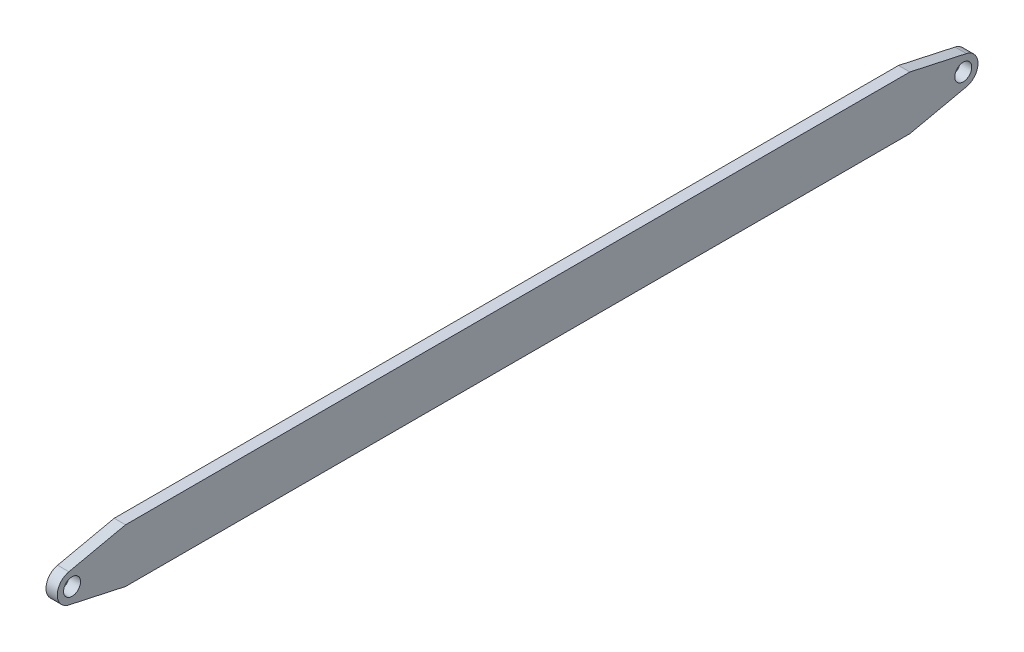
ISO-10303-21;
HEADER;
FILE_DESCRIPTION(('STEP AP214'),'2;1');
FILE_NAME('part.step','',(''),(''),'','','');
FILE_SCHEMA(('AUTOMOTIVE_DESIGN { 1 0 10303 214 1 1 1 1 }'));
ENDSEC;
DATA;
#1=APPLICATION_CONTEXT('core data for automotive mechanical design processes');
#2=APPLICATION_PROTOCOL_DEFINITION('international standard','automotive_design',2000,#1);
#3=PRODUCT_CONTEXT('',#1,'mechanical');
#4=PRODUCT('Part','Part','',(#3));
#5=PRODUCT_RELATED_PRODUCT_CATEGORY('part','',(#4));
#6=PRODUCT_DEFINITION_FORMATION('','',#4);
#7=PRODUCT_DEFINITION_CONTEXT('part definition',#1,'design');
#8=PRODUCT_DEFINITION('design','',#6,#7);
#9=PRODUCT_DEFINITION_SHAPE('','',#8);
#10=(LENGTH_UNIT() NAMED_UNIT(*) SI_UNIT(.MILLI.,.METRE.));
#11=(NAMED_UNIT(*) PLANE_ANGLE_UNIT() SI_UNIT($,.RADIAN.));
#12=(NAMED_UNIT(*) SI_UNIT($,.STERADIAN.) SOLID_ANGLE_UNIT());
#13=UNCERTAINTY_MEASURE_WITH_UNIT(LENGTH_MEASURE(1.E-05),#10,'distance_accuracy_value','');
#14=(GEOMETRIC_REPRESENTATION_CONTEXT(3) GLOBAL_UNCERTAINTY_ASSIGNED_CONTEXT((#13)) GLOBAL_UNIT_ASSIGNED_CONTEXT((#10,
#11,#12)) REPRESENTATION_CONTEXT('',''));
#15=CARTESIAN_POINT('',(0.,0.,0.));
#16=DIRECTION('',(0.,0.,1.));
#17=DIRECTION('',(1.,0.,0.));
#18=AXIS2_PLACEMENT_3D('',#15,#16,#17);
#19=CARTESIAN_POINT('',(3.175,0.,-500.));
#20=DIRECTION('',(-1.,0.,0.));
#21=DIRECTION('',(0.,0.,1.));
#22=AXIS2_PLACEMENT_3D('',#19,#20,#21);
#23=PLANE('',#22);
#24=DIRECTION('',(0.,0.213098674662795,0.977030682658923));
#25=VECTOR('',#24,1.);
#26=CARTESIAN_POINT('',(3.175,15.,-470.));
#27=LINE('',#26,#25);
#28=CARTESIAN_POINT('',(3.175,8.07271601546935,-501.760727799401));
#29=VERTEX_POINT('',#28);
#30=CARTESIAN_POINT('',(3.175,15.,-470.));
#31=VERTEX_POINT('',#30);
#32=EDGE_CURVE('E164',#29,#31,#27,.T.);
#33=ORIENTED_EDGE('',*,*,#32,.T.);
#34=DIRECTION('',(0.,0.,1.));
#35=VECTOR('',#34,1.);
#36=CARTESIAN_POINT('',(3.175,15.,-30.));
#37=LINE('',#36,#35);
#38=CARTESIAN_POINT('',(3.175,15.,-30.));
#39=VERTEX_POINT('',#38);
#40=EDGE_CURVE('E100',#31,#39,#37,.T.);
#41=ORIENTED_EDGE('',*,*,#40,.T.);
#42=DIRECTION('',(0.,-0.213098674662795,0.977030682658923));
#43=VECTOR('',#42,1.);
#44=CARTESIAN_POINT('',(3.175,15.,-30.));
#45=LINE('',#44,#43);
#46=CARTESIAN_POINT('',(3.175,8.07271601546935,1.76072779940134));
#47=VERTEX_POINT('',#46);
#48=EDGE_CURVE('E185',#39,#47,#45,.T.);
#49=ORIENTED_EDGE('',*,*,#48,.T.);
#50=CARTESIAN_POINT('',(3.175,0.,0.));
#51=DIRECTION('',(1.,0.,0.));
#52=DIRECTION('',(0.,0.,-1.));
#53=AXIS2_PLACEMENT_3D('',#50,#51,#52);
#54=CIRCLE('',#53,8.2625);
#55=CARTESIAN_POINT('',(3.175,-8.07271601546935,1.76072779940135));
#56=VERTEX_POINT('',#55);
#57=EDGE_CURVE('E199',#47,#56,#54,.T.);
#58=ORIENTED_EDGE('',*,*,#57,.T.);
#59=DIRECTION('',(0.,-0.213098674662795,-0.977030682658923));
#60=VECTOR('',#59,1.);
#61=CARTESIAN_POINT('',(3.175,-15.,-30.));
#62=LINE('',#61,#60);
#63=CARTESIAN_POINT('',(3.175,-15.,-30.));
#64=VERTEX_POINT('',#63);
#65=EDGE_CURVE('E119',#56,#64,#62,.T.);
#66=ORIENTED_EDGE('',*,*,#65,.T.);
#67=DIRECTION('',(0.,0.,-1.));
#68=VECTOR('',#67,1.);
#69=CARTESIAN_POINT('',(3.175,-15.,-30.));
#70=LINE('',#69,#68);
#71=CARTESIAN_POINT('',(3.175,-15.,-470.));
#72=VERTEX_POINT('',#71);
#73=EDGE_CURVE('E113',#64,#72,#70,.T.);
#74=ORIENTED_EDGE('',*,*,#73,.T.);
#75=DIRECTION('',(0.,0.213098674662795,-0.977030682658923));
#76=VECTOR('',#75,1.);
#77=CARTESIAN_POINT('',(3.175,-15.,-470.));
#78=LINE('',#77,#76);
#79=CARTESIAN_POINT('',(3.175,-8.07271601546935,-501.760727799401));
#80=VERTEX_POINT('',#79);
#81=EDGE_CURVE('E117',#72,#80,#78,.T.);
#82=ORIENTED_EDGE('',*,*,#81,.T.);
#83=CARTESIAN_POINT('',(3.175,0.,-500.));
#84=DIRECTION('',(1.,0.,0.));
#85=DIRECTION('',(0.,0.,1.));
#86=AXIS2_PLACEMENT_3D('',#83,#84,#85);
#87=CIRCLE('',#86,8.26249999999999);
#88=EDGE_CURVE('E57',#80,#29,#87,.T.);
#89=ORIENTED_EDGE('',*,*,#88,.T.);
#90=EDGE_LOOP('',(#33,#41,#49,#58,#66,#74,#82,#89));
#91=FACE_BOUND('',#90,.T.);
#92=CARTESIAN_POINT('',(3.175,0.,0.));
#93=DIRECTION('',(1.,0.,0.));
#94=DIRECTION('',(0.,0.,-1.));
#95=AXIS2_PLACEMENT_3D('',#92,#93,#94);
#96=CIRCLE('',#95,4.76250000000001);
#97=CARTESIAN_POINT('',(3.175,0.,-4.76250000000001));
#98=VERTEX_POINT('',#97);
#99=EDGE_CURVE('E146',#98,#98,#96,.T.);
#100=ORIENTED_EDGE('',*,*,#99,.F.);
#101=EDGE_LOOP('',(#100));
#102=FACE_BOUND('',#101,.T.);
#103=CARTESIAN_POINT('',(3.175,0.,-500.));
#104=DIRECTION('',(1.,0.,0.));
#105=DIRECTION('',(0.,0.,1.));
#106=AXIS2_PLACEMENT_3D('',#103,#104,#105);
#107=CIRCLE('',#106,4.76250000000001);
#108=CARTESIAN_POINT('',(3.175,0.,-495.2375));
#109=VERTEX_POINT('',#108);
#110=EDGE_CURVE('E213',#109,#109,#107,.T.);
#111=ORIENTED_EDGE('',*,*,#110,.F.);
#112=EDGE_LOOP('',(#111));
#113=FACE_BOUND('',#112,.T.);
#114=ADVANCED_FACE('F39',(#91,#102,#113),#23,.F.);
#115=CARTESIAN_POINT('',(-3.175,0.,-500.));
#116=DIRECTION('',(-1.,0.,0.));
#117=DIRECTION('',(0.,0.,1.));
#118=AXIS2_PLACEMENT_3D('',#115,#116,#117);
#119=PLANE('',#118);
#120=CARTESIAN_POINT('',(-3.175,0.,0.));
#121=DIRECTION('',(1.,0.,0.));
#122=DIRECTION('',(0.,0.,-1.));
#123=AXIS2_PLACEMENT_3D('',#120,#121,#122);
#124=CIRCLE('',#123,4.76250000000001);
#125=CARTESIAN_POINT('',(-3.175,0.,-4.76250000000001));
#126=VERTEX_POINT('',#125);
#127=EDGE_CURVE('E209',#126,#126,#124,.T.);
#128=ORIENTED_EDGE('',*,*,#127,.T.);
#129=EDGE_LOOP('',(#128));
#130=FACE_BOUND('',#129,.T.);
#131=DIRECTION('',(0.,0.213098674662795,0.977030682658923));
#132=VECTOR('',#131,1.);
#133=CARTESIAN_POINT('',(-3.175,15.,-470.));
#134=LINE('',#133,#132);
#135=CARTESIAN_POINT('',(-3.175,8.07271601546935,-501.760727799401));
#136=VERTEX_POINT('',#135);
#137=CARTESIAN_POINT('',(-3.175,15.,-470.));
#138=VERTEX_POINT('',#137);
#139=EDGE_CURVE('E141',#136,#138,#134,.T.);
#140=ORIENTED_EDGE('',*,*,#139,.F.);
#141=CARTESIAN_POINT('',(-3.175,0.,-500.));
#142=DIRECTION('',(1.,0.,0.));
#143=DIRECTION('',(0.,0.,1.));
#144=AXIS2_PLACEMENT_3D('',#141,#142,#143);
#145=CIRCLE('',#144,8.26249999999999);
#146=CARTESIAN_POINT('',(-3.175,-8.07271601546935,-501.760727799401));
#147=VERTEX_POINT('',#146);
#148=EDGE_CURVE('E92',#147,#136,#145,.T.);
#149=ORIENTED_EDGE('',*,*,#148,.F.);
#150=DIRECTION('',(0.,0.213098674662795,-0.977030682658923));
#151=VECTOR('',#150,1.);
#152=CARTESIAN_POINT('',(-3.175,-15.,-470.));
#153=LINE('',#152,#151);
#154=CARTESIAN_POINT('',(-3.175,-15.,-470.));
#155=VERTEX_POINT('',#154);
#156=EDGE_CURVE('E86',#155,#147,#153,.T.);
#157=ORIENTED_EDGE('',*,*,#156,.F.);
#158=DIRECTION('',(0.,0.,-1.));
#159=VECTOR('',#158,1.);
#160=CARTESIAN_POINT('',(-3.175,-15.,-30.));
#161=LINE('',#160,#159);
#162=CARTESIAN_POINT('',(-3.175,-15.,-30.));
#163=VERTEX_POINT('',#162);
#164=EDGE_CURVE('E128',#163,#155,#161,.T.);
#165=ORIENTED_EDGE('',*,*,#164,.F.);
#166=DIRECTION('',(0.,-0.213098674662795,-0.977030682658923));
#167=VECTOR('',#166,1.);
#168=CARTESIAN_POINT('',(-3.175,-15.,-30.));
#169=LINE('',#168,#167);
#170=CARTESIAN_POINT('',(-3.175,-8.07271601546935,1.76072779940135));
#171=VERTEX_POINT('',#170);
#172=EDGE_CURVE('E155',#171,#163,#169,.T.);
#173=ORIENTED_EDGE('',*,*,#172,.F.);
#174=CARTESIAN_POINT('',(-3.175,0.,0.));
#175=DIRECTION('',(1.,0.,0.));
#176=DIRECTION('',(0.,0.,-1.));
#177=AXIS2_PLACEMENT_3D('',#174,#175,#176);
#178=CIRCLE('',#177,8.2625);
#179=CARTESIAN_POINT('',(-3.175,8.07271601546935,1.76072779940134));
#180=VERTEX_POINT('',#179);
#181=EDGE_CURVE('E152',#180,#171,#178,.T.);
#182=ORIENTED_EDGE('',*,*,#181,.F.);
#183=DIRECTION('',(0.,-0.213098674662795,0.977030682658923));
#184=VECTOR('',#183,1.);
#185=CARTESIAN_POINT('',(-3.175,15.,-30.));
#186=LINE('',#185,#184);
#187=CARTESIAN_POINT('',(-3.175,15.,-30.));
#188=VERTEX_POINT('',#187);
#189=EDGE_CURVE('E149',#188,#180,#186,.T.);
#190=ORIENTED_EDGE('',*,*,#189,.F.);
#191=DIRECTION('',(0.,0.,1.));
#192=VECTOR('',#191,1.);
#193=CARTESIAN_POINT('',(-3.175,15.,-30.));
#194=LINE('',#193,#192);
#195=EDGE_CURVE('E145',#138,#188,#194,.T.);
#196=ORIENTED_EDGE('',*,*,#195,.F.);
#197=EDGE_LOOP('',(#140,#149,#157,#165,#173,#182,#190,#196));
#198=FACE_BOUND('',#197,.T.);
#199=CARTESIAN_POINT('',(-3.175,0.,-500.));
#200=DIRECTION('',(1.,0.,0.));
#201=DIRECTION('',(0.,0.,1.));
#202=AXIS2_PLACEMENT_3D('',#199,#200,#201);
#203=CIRCLE('',#202,4.76250000000001);
#204=CARTESIAN_POINT('',(-3.175,0.,-495.2375));
#205=VERTEX_POINT('',#204);
#206=EDGE_CURVE('E217',#205,#205,#203,.T.);
#207=ORIENTED_EDGE('',*,*,#206,.T.);
#208=EDGE_LOOP('',(#207));
#209=FACE_BOUND('',#208,.T.);
#210=ADVANCED_FACE('F189',(#130,#198,#209),#119,.T.);
#211=CARTESIAN_POINT('',(3.175,15.,-470.));
#212=DIRECTION('',(0.,-0.977030682658922,0.213098674662795));
#213=DIRECTION('',(0.,-0.213098674662795,-0.977030682658923));
#214=AXIS2_PLACEMENT_3D('',#211,#212,#213);
#215=PLANE('',#214);
#216=ORIENTED_EDGE('',*,*,#139,.T.);
#217=DIRECTION('',(-1.,0.,0.));
#218=VECTOR('',#217,1.);
#219=CARTESIAN_POINT('',(3.175,15.,-470.));
#220=LINE('',#219,#218);
#221=EDGE_CURVE('E11',#31,#138,#220,.T.);
#222=ORIENTED_EDGE('',*,*,#221,.F.);
#223=ORIENTED_EDGE('',*,*,#32,.F.);
#224=DIRECTION('',(-1.,0.,0.));
#225=VECTOR('',#224,1.);
#226=CARTESIAN_POINT('',(3.175,8.07271601546935,-501.760727799401));
#227=LINE('',#226,#225);
#228=EDGE_CURVE('E137',#29,#136,#227,.T.);
#229=ORIENTED_EDGE('',*,*,#228,.T.);
#230=EDGE_LOOP('',(#216,#222,#223,#229));
#231=FACE_BOUND('',#230,.T.);
#232=ADVANCED_FACE('F41',(#231),#215,.F.);
#233=CARTESIAN_POINT('',(3.175,15.,-30.));
#234=DIRECTION('',(0.,-1.,0.));
#235=DIRECTION('',(0.,0.,-1.));
#236=AXIS2_PLACEMENT_3D('',#233,#234,#235);
#237=PLANE('',#236);
#238=ORIENTED_EDGE('',*,*,#195,.T.);
#239=DIRECTION('',(-1.,0.,0.));
#240=VECTOR('',#239,1.);
#241=CARTESIAN_POINT('',(3.175,15.,-30.));
#242=LINE('',#241,#240);
#243=EDGE_CURVE('E49',#39,#188,#242,.T.);
#244=ORIENTED_EDGE('',*,*,#243,.F.);
#245=ORIENTED_EDGE('',*,*,#40,.F.);
#246=ORIENTED_EDGE('',*,*,#221,.T.);
#247=EDGE_LOOP('',(#238,#244,#245,#246));
#248=FACE_BOUND('',#247,.T.);
#249=ADVANCED_FACE('F251',(#248),#237,.F.);
#250=CARTESIAN_POINT('',(3.175,15.,-30.));
#251=DIRECTION('',(0.,-0.977030682658923,-0.213098674662795));
#252=DIRECTION('',(0.,0.213098674662795,-0.977030682658923));
#253=AXIS2_PLACEMENT_3D('',#250,#251,#252);
#254=PLANE('',#253);
#255=ORIENTED_EDGE('',*,*,#189,.T.);
#256=DIRECTION('',(-1.,0.,0.));
#257=VECTOR('',#256,1.);
#258=CARTESIAN_POINT('',(3.175,8.07271601546935,1.76072779940134));
#259=LINE('',#258,#257);
#260=EDGE_CURVE('E175',#47,#180,#259,.T.);
#261=ORIENTED_EDGE('',*,*,#260,.F.);
#262=ORIENTED_EDGE('',*,*,#48,.F.);
#263=ORIENTED_EDGE('',*,*,#243,.T.);
#264=EDGE_LOOP('',(#255,#261,#262,#263));
#265=FACE_BOUND('',#264,.T.);
#266=ADVANCED_FACE('F183',(#265),#254,.F.);
#267=CARTESIAN_POINT('',(3.175,0.,0.));
#268=DIRECTION('',(-1.,0.,0.));
#269=DIRECTION('',(0.,0.,1.));
#270=AXIS2_PLACEMENT_3D('',#267,#268,#269);
#271=CYLINDRICAL_SURFACE('',#270,8.2625);
#272=ORIENTED_EDGE('',*,*,#181,.T.);
#273=DIRECTION('',(-1.,0.,0.));
#274=VECTOR('',#273,1.);
#275=CARTESIAN_POINT('',(3.175,-8.07271601546935,1.76072779940135));
#276=LINE('',#275,#274);
#277=EDGE_CURVE('E171',#56,#171,#276,.T.);
#278=ORIENTED_EDGE('',*,*,#277,.F.);
#279=ORIENTED_EDGE('',*,*,#57,.F.);
#280=ORIENTED_EDGE('',*,*,#260,.T.);
#281=EDGE_LOOP('',(#272,#278,#279,#280));
#282=FACE_BOUND('',#281,.T.);
#283=ADVANCED_FACE('F194',(#282),#271,.T.);
#284=CARTESIAN_POINT('',(3.175,-15.,-30.));
#285=DIRECTION('',(0.,0.977030682658923,-0.213098674662795));
#286=DIRECTION('',(0.,0.213098674662795,0.977030682658923));
#287=AXIS2_PLACEMENT_3D('',#284,#285,#286);
#288=PLANE('',#287);
#289=ORIENTED_EDGE('',*,*,#172,.T.);
#290=DIRECTION('',(-1.,0.,0.));
#291=VECTOR('',#290,1.);
#292=CARTESIAN_POINT('',(3.175,-15.,-30.));
#293=LINE('',#292,#291);
#294=EDGE_CURVE('E130',#64,#163,#293,.T.);
#295=ORIENTED_EDGE('',*,*,#294,.F.);
#296=ORIENTED_EDGE('',*,*,#65,.F.);
#297=ORIENTED_EDGE('',*,*,#277,.T.);
#298=EDGE_LOOP('',(#289,#295,#296,#297));
#299=FACE_BOUND('',#298,.T.);
#300=ADVANCED_FACE('F197',(#299),#288,.F.);
#301=CARTESIAN_POINT('',(3.175,-15.,-30.));
#302=DIRECTION('',(0.,1.,0.));
#303=DIRECTION('',(0.,0.,1.));
#304=AXIS2_PLACEMENT_3D('',#301,#302,#303);
#305=PLANE('',#304);
#306=ORIENTED_EDGE('',*,*,#164,.T.);
#307=DIRECTION('',(-1.,0.,0.));
#308=VECTOR('',#307,1.);
#309=CARTESIAN_POINT('',(3.175,-15.,-470.));
#310=LINE('',#309,#308);
#311=EDGE_CURVE('E125',#72,#155,#310,.T.);
#312=ORIENTED_EDGE('',*,*,#311,.F.);
#313=ORIENTED_EDGE('',*,*,#73,.F.);
#314=ORIENTED_EDGE('',*,*,#294,.T.);
#315=EDGE_LOOP('',(#306,#312,#313,#314));
#316=FACE_BOUND('',#315,.T.);
#317=ADVANCED_FACE('F126',(#316),#305,.F.);
#318=CARTESIAN_POINT('',(3.175,-15.,-470.));
#319=DIRECTION('',(0.,0.977030682658922,0.213098674662795));
#320=DIRECTION('',(0.,-0.213098674662795,0.977030682658923));
#321=AXIS2_PLACEMENT_3D('',#318,#319,#320);
#322=PLANE('',#321);
#323=ORIENTED_EDGE('',*,*,#156,.T.);
#324=DIRECTION('',(-1.,0.,0.));
#325=VECTOR('',#324,1.);
#326=CARTESIAN_POINT('',(3.175,-8.07271601546935,-501.760727799401));
#327=LINE('',#326,#325);
#328=EDGE_CURVE('E131',#80,#147,#327,.T.);
#329=ORIENTED_EDGE('',*,*,#328,.F.);
#330=ORIENTED_EDGE('',*,*,#81,.F.);
#331=ORIENTED_EDGE('',*,*,#311,.T.);
#332=EDGE_LOOP('',(#323,#329,#330,#331));
#333=FACE_BOUND('',#332,.T.);
#334=ADVANCED_FACE('F133',(#333),#322,.F.);
#335=CARTESIAN_POINT('',(3.175,0.,-500.));
#336=DIRECTION('',(-1.,0.,0.));
#337=DIRECTION('',(0.,0.,1.));
#338=AXIS2_PLACEMENT_3D('',#335,#336,#337);
#339=CYLINDRICAL_SURFACE('',#338,8.26249999999999);
#340=ORIENTED_EDGE('',*,*,#148,.T.);
#341=ORIENTED_EDGE('',*,*,#228,.F.);
#342=ORIENTED_EDGE('',*,*,#88,.F.);
#343=ORIENTED_EDGE('',*,*,#328,.T.);
#344=EDGE_LOOP('',(#340,#341,#342,#343));
#345=FACE_BOUND('',#344,.T.);
#346=ADVANCED_FACE('F239',(#345),#339,.T.);
#347=CARTESIAN_POINT('',(3.175,0.,0.));
#348=DIRECTION('',(-1.,0.,0.));
#349=DIRECTION('',(0.,0.,1.));
#350=AXIS2_PLACEMENT_3D('',#347,#348,#349);
#351=CYLINDRICAL_SURFACE('',#350,4.76250000000001);
#352=ORIENTED_EDGE('',*,*,#99,.T.);
#353=EDGE_LOOP('',(#352));
#354=FACE_BOUND('',#353,.T.);
#355=ORIENTED_EDGE('',*,*,#127,.F.);
#356=EDGE_LOOP('',(#355));
#357=FACE_BOUND('',#356,.T.);
#358=ADVANCED_FACE('F236',(#354,#357),#351,.F.);
#359=CARTESIAN_POINT('',(3.175,0.,-500.));
#360=DIRECTION('',(-1.,0.,0.));
#361=DIRECTION('',(0.,0.,1.));
#362=AXIS2_PLACEMENT_3D('',#359,#360,#361);
#363=CYLINDRICAL_SURFACE('',#362,4.76250000000001);
#364=ORIENTED_EDGE('',*,*,#110,.T.);
#365=EDGE_LOOP('',(#364));
#366=FACE_BOUND('',#365,.T.);
#367=ORIENTED_EDGE('',*,*,#206,.F.);
#368=EDGE_LOOP('',(#367));
#369=FACE_BOUND('',#368,.T.);
#370=ADVANCED_FACE('F225',(#366,#369),#363,.F.);
#371=CLOSED_SHELL('',(#114,#210,#232,#249,#266,#283,#300,#317,#334,#346,#358,#370));
#372=MANIFOLD_SOLID_BREP('B2',#371);
#373=ADVANCED_BREP_SHAPE_REPRESENTATION('',(#18,#372),#14);
#374=SHAPE_DEFINITION_REPRESENTATION(#9,#373);
ENDSEC;
END-ISO-10303-21;
